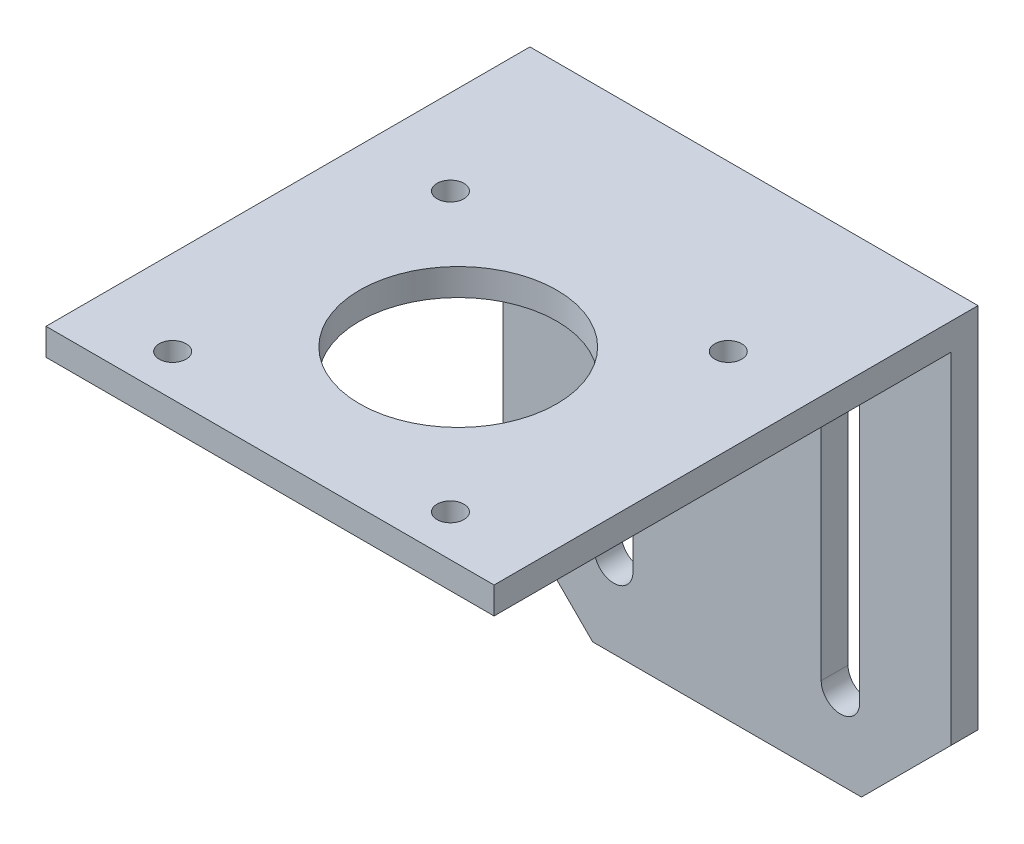
ISO-10303-21;
HEADER;
FILE_DESCRIPTION(('STEP AP214'),'2;1');
FILE_NAME('part.step','',(''),(''),'','','');
FILE_SCHEMA(('AUTOMOTIVE_DESIGN { 1 0 10303 214 1 1 1 1 }'));
ENDSEC;
DATA;
#1=APPLICATION_CONTEXT('core data for automotive mechanical design processes');
#2=APPLICATION_PROTOCOL_DEFINITION('international standard','automotive_design',2000,#1);
#3=PRODUCT_CONTEXT('',#1,'mechanical');
#4=PRODUCT('Part','Part','',(#3));
#5=PRODUCT_RELATED_PRODUCT_CATEGORY('part','',(#4));
#6=PRODUCT_DEFINITION_FORMATION('','',#4);
#7=PRODUCT_DEFINITION_CONTEXT('part definition',#1,'design');
#8=PRODUCT_DEFINITION('design','',#6,#7);
#9=PRODUCT_DEFINITION_SHAPE('','',#8);
#10=(LENGTH_UNIT() NAMED_UNIT(*) SI_UNIT(.MILLI.,.METRE.));
#11=(NAMED_UNIT(*) PLANE_ANGLE_UNIT() SI_UNIT($,.RADIAN.));
#12=(NAMED_UNIT(*) SI_UNIT($,.STERADIAN.) SOLID_ANGLE_UNIT());
#13=UNCERTAINTY_MEASURE_WITH_UNIT(LENGTH_MEASURE(1.E-05),#10,'distance_accuracy_value','');
#14=(GEOMETRIC_REPRESENTATION_CONTEXT(3) GLOBAL_UNCERTAINTY_ASSIGNED_CONTEXT((#13)) GLOBAL_UNIT_ASSIGNED_CONTEXT((#10,
#11,#12)) REPRESENTATION_CONTEXT('',''));
#15=CARTESIAN_POINT('',(0.,0.,0.));
#16=DIRECTION('',(0.,0.,1.));
#17=DIRECTION('',(1.,0.,0.));
#18=AXIS2_PLACEMENT_3D('',#15,#16,#17);
#19=CARTESIAN_POINT('',(0.,0.,3.));
#20=DIRECTION('',(0.,0.,1.));
#21=DIRECTION('',(1.,0.,0.));
#22=AXIS2_PLACEMENT_3D('',#19,#20,#21);
#23=PLANE('',#22);
#24=DIRECTION('',(1.,0.,0.));
#25=VECTOR('',#24,1.);
#26=CARTESIAN_POINT('',(25.,22.5,3.));
#27=LINE('',#26,#25);
#28=CARTESIAN_POINT('',(-25.,22.5,3.));
#29=VERTEX_POINT('',#28);
#30=CARTESIAN_POINT('',(25.,22.5,3.));
#31=VERTEX_POINT('',#30);
#32=EDGE_CURVE('E53',#29,#31,#27,.T.);
#33=ORIENTED_EDGE('',*,*,#32,.F.);
#34=DIRECTION('',(0.,-1.,0.));
#35=VECTOR('',#34,1.);
#36=CARTESIAN_POINT('',(-25.,-25.5,3.));
#37=LINE('',#36,#35);
#38=CARTESIAN_POINT('',(-25.,-15.5,3.));
#39=VERTEX_POINT('',#38);
#40=EDGE_CURVE('E173',#29,#39,#37,.T.);
#41=ORIENTED_EDGE('',*,*,#40,.T.);
#42=DIRECTION('',(-0.707106781186548,0.707106781186548,0.));
#43=VECTOR('',#42,1.);
#44=CARTESIAN_POINT('',(-15.,-25.5,3.));
#45=LINE('',#44,#43);
#46=CARTESIAN_POINT('',(-15.,-25.5,3.));
#47=VERTEX_POINT('',#46);
#48=EDGE_CURVE('E175',#47,#39,#45,.T.);
#49=ORIENTED_EDGE('',*,*,#48,.F.);
#50=DIRECTION('',(1.,0.,0.));
#51=VECTOR('',#50,1.);
#52=CARTESIAN_POINT('',(25.,-25.5,3.));
#53=LINE('',#52,#51);
#54=CARTESIAN_POINT('',(15.,-25.5,3.));
#55=VERTEX_POINT('',#54);
#56=EDGE_CURVE('E260',#47,#55,#53,.T.);
#57=ORIENTED_EDGE('',*,*,#56,.T.);
#58=DIRECTION('',(-0.707106781186547,-0.707106781186548,0.));
#59=VECTOR('',#58,1.);
#60=CARTESIAN_POINT('',(25.,-15.5,3.));
#61=LINE('',#60,#59);
#62=CARTESIAN_POINT('',(25.,-15.5,3.));
#63=VERTEX_POINT('',#62);
#64=EDGE_CURVE('E180',#63,#55,#61,.T.);
#65=ORIENTED_EDGE('',*,*,#64,.F.);
#66=DIRECTION('',(0.,1.,0.));
#67=VECTOR('',#66,1.);
#68=CARTESIAN_POINT('',(25.,-25.5,3.));
#69=LINE('',#68,#67);
#70=EDGE_CURVE('E264',#63,#31,#69,.T.);
#71=ORIENTED_EDGE('',*,*,#70,.T.);
#72=EDGE_LOOP('',(#33,#41,#49,#57,#65,#71));
#73=FACE_BOUND('',#72,.T.);
#74=DIRECTION('',(0.,-1.,0.));
#75=VECTOR('',#74,1.);
#76=CARTESIAN_POINT('',(-14.8,17.5,3.));
#77=LINE('',#76,#75);
#78=CARTESIAN_POINT('',(-14.8,17.5,3.));
#79=VERTEX_POINT('',#78);
#80=CARTESIAN_POINT('',(-14.8,-16.5,3.));
#81=VERTEX_POINT('',#80);
#82=EDGE_CURVE('E230',#79,#81,#77,.T.);
#83=ORIENTED_EDGE('',*,*,#82,.F.);
#84=CARTESIAN_POINT('',(-12.65,17.5,3.));
#85=DIRECTION('',(0.,0.,1.));
#86=DIRECTION('',(1.,0.,0.));
#87=AXIS2_PLACEMENT_3D('',#84,#85,#86);
#88=CIRCLE('',#87,2.15);
#89=CARTESIAN_POINT('',(-10.5,17.5,3.));
#90=VERTEX_POINT('',#89);
#91=EDGE_CURVE('E228',#90,#79,#88,.T.);
#92=ORIENTED_EDGE('',*,*,#91,.F.);
#93=DIRECTION('',(0.,1.,0.));
#94=VECTOR('',#93,1.);
#95=CARTESIAN_POINT('',(-10.5,17.5,3.));
#96=LINE('',#95,#94);
#97=CARTESIAN_POINT('',(-10.5,-16.5,3.));
#98=VERTEX_POINT('',#97);
#99=EDGE_CURVE('E236',#98,#90,#96,.T.);
#100=ORIENTED_EDGE('',*,*,#99,.F.);
#101=CARTESIAN_POINT('',(-12.65,-16.5,3.));
#102=DIRECTION('',(0.,0.,1.));
#103=DIRECTION('',(1.,0.,0.));
#104=AXIS2_PLACEMENT_3D('',#101,#102,#103);
#105=CIRCLE('',#104,2.15);
#106=EDGE_CURVE('E233',#81,#98,#105,.T.);
#107=ORIENTED_EDGE('',*,*,#106,.F.);
#108=EDGE_LOOP('',(#83,#92,#100,#107));
#109=FACE_BOUND('',#108,.T.);
#110=DIRECTION('',(0.,-1.,0.));
#111=VECTOR('',#110,1.);
#112=CARTESIAN_POINT('',(10.5,17.5,3.));
#113=LINE('',#112,#111);
#114=CARTESIAN_POINT('',(10.5,17.5,3.));
#115=VERTEX_POINT('',#114);
#116=CARTESIAN_POINT('',(10.5,-16.5,3.));
#117=VERTEX_POINT('',#116);
#118=EDGE_CURVE('E199',#115,#117,#113,.T.);
#119=ORIENTED_EDGE('',*,*,#118,.F.);
#120=CARTESIAN_POINT('',(12.65,17.5,3.));
#121=DIRECTION('',(0.,0.,1.));
#122=DIRECTION('',(-1.,0.,0.));
#123=AXIS2_PLACEMENT_3D('',#120,#121,#122);
#124=CIRCLE('',#123,2.15);
#125=CARTESIAN_POINT('',(14.8,17.5,3.));
#126=VERTEX_POINT('',#125);
#127=EDGE_CURVE('E197',#126,#115,#124,.T.);
#128=ORIENTED_EDGE('',*,*,#127,.F.);
#129=DIRECTION('',(0.,1.,0.));
#130=VECTOR('',#129,1.);
#131=CARTESIAN_POINT('',(14.8,17.5,3.));
#132=LINE('',#131,#130);
#133=CARTESIAN_POINT('',(14.8,-16.5,3.));
#134=VERTEX_POINT('',#133);
#135=EDGE_CURVE('E205',#134,#126,#132,.T.);
#136=ORIENTED_EDGE('',*,*,#135,.F.);
#137=CARTESIAN_POINT('',(12.65,-16.5,3.));
#138=DIRECTION('',(0.,0.,1.));
#139=DIRECTION('',(-1.,0.,0.));
#140=AXIS2_PLACEMENT_3D('',#137,#138,#139);
#141=CIRCLE('',#140,2.15);
#142=EDGE_CURVE('E202',#117,#134,#141,.T.);
#143=ORIENTED_EDGE('',*,*,#142,.F.);
#144=EDGE_LOOP('',(#119,#128,#136,#143));
#145=FACE_BOUND('',#144,.T.);
#146=ADVANCED_FACE('F36',(#73,#109,#145),#23,.T.);
#147=CARTESIAN_POINT('',(0.,0.,0.));
#148=DIRECTION('',(0.,0.,1.));
#149=DIRECTION('',(1.,0.,0.));
#150=AXIS2_PLACEMENT_3D('',#147,#148,#149);
#151=PLANE('',#150);
#152=CARTESIAN_POINT('',(-12.65,17.5,0.));
#153=DIRECTION('',(0.,0.,1.));
#154=DIRECTION('',(1.,0.,0.));
#155=AXIS2_PLACEMENT_3D('',#152,#153,#154);
#156=CIRCLE('',#155,2.15);
#157=CARTESIAN_POINT('',(-10.5,17.5,0.));
#158=VERTEX_POINT('',#157);
#159=CARTESIAN_POINT('',(-14.8,17.5,0.));
#160=VERTEX_POINT('',#159);
#161=EDGE_CURVE('E227',#158,#160,#156,.T.);
#162=ORIENTED_EDGE('',*,*,#161,.T.);
#163=DIRECTION('',(0.,-1.,0.));
#164=VECTOR('',#163,1.);
#165=CARTESIAN_POINT('',(-14.8,17.5,0.));
#166=LINE('',#165,#164);
#167=CARTESIAN_POINT('',(-14.8,-16.5,0.));
#168=VERTEX_POINT('',#167);
#169=EDGE_CURVE('E241',#160,#168,#166,.T.);
#170=ORIENTED_EDGE('',*,*,#169,.T.);
#171=CARTESIAN_POINT('',(-12.65,-16.5,0.));
#172=DIRECTION('',(0.,0.,1.));
#173=DIRECTION('',(1.,0.,0.));
#174=AXIS2_PLACEMENT_3D('',#171,#172,#173);
#175=CIRCLE('',#174,2.15);
#176=CARTESIAN_POINT('',(-10.5,-16.5,0.));
#177=VERTEX_POINT('',#176);
#178=EDGE_CURVE('E244',#168,#177,#175,.T.);
#179=ORIENTED_EDGE('',*,*,#178,.T.);
#180=DIRECTION('',(0.,1.,0.));
#181=VECTOR('',#180,1.);
#182=CARTESIAN_POINT('',(-10.5,17.5,0.));
#183=LINE('',#182,#181);
#184=EDGE_CURVE('E231',#177,#158,#183,.T.);
#185=ORIENTED_EDGE('',*,*,#184,.T.);
#186=EDGE_LOOP('',(#162,#170,#179,#185));
#187=FACE_BOUND('',#186,.T.);
#188=CARTESIAN_POINT('',(12.65,17.5,0.));
#189=DIRECTION('',(0.,0.,1.));
#190=DIRECTION('',(-1.,0.,0.));
#191=AXIS2_PLACEMENT_3D('',#188,#189,#190);
#192=CIRCLE('',#191,2.15);
#193=CARTESIAN_POINT('',(14.8,17.5,0.));
#194=VERTEX_POINT('',#193);
#195=CARTESIAN_POINT('',(10.5,17.5,0.));
#196=VERTEX_POINT('',#195);
#197=EDGE_CURVE('E190',#194,#196,#192,.T.);
#198=ORIENTED_EDGE('',*,*,#197,.T.);
#199=DIRECTION('',(0.,-1.,0.));
#200=VECTOR('',#199,1.);
#201=CARTESIAN_POINT('',(10.5,17.5,0.));
#202=LINE('',#201,#200);
#203=CARTESIAN_POINT('',(10.5,-16.5,0.));
#204=VERTEX_POINT('',#203);
#205=EDGE_CURVE('E210',#196,#204,#202,.T.);
#206=ORIENTED_EDGE('',*,*,#205,.T.);
#207=CARTESIAN_POINT('',(12.65,-16.5,0.));
#208=DIRECTION('',(0.,0.,1.));
#209=DIRECTION('',(-1.,0.,0.));
#210=AXIS2_PLACEMENT_3D('',#207,#208,#209);
#211=CIRCLE('',#210,2.15);
#212=CARTESIAN_POINT('',(14.8,-16.5,0.));
#213=VERTEX_POINT('',#212);
#214=EDGE_CURVE('E213',#204,#213,#211,.T.);
#215=ORIENTED_EDGE('',*,*,#214,.T.);
#216=DIRECTION('',(0.,1.,0.));
#217=VECTOR('',#216,1.);
#218=CARTESIAN_POINT('',(14.8,17.5,0.));
#219=LINE('',#218,#217);
#220=EDGE_CURVE('E200',#213,#194,#219,.T.);
#221=ORIENTED_EDGE('',*,*,#220,.T.);
#222=EDGE_LOOP('',(#198,#206,#215,#221));
#223=FACE_BOUND('',#222,.T.);
#224=DIRECTION('',(-0.707106781186547,-0.707106781186548,0.));
#225=VECTOR('',#224,1.);
#226=CARTESIAN_POINT('',(25.,-15.5,0.));
#227=LINE('',#226,#225);
#228=CARTESIAN_POINT('',(25.,-15.5,0.));
#229=VERTEX_POINT('',#228);
#230=CARTESIAN_POINT('',(15.,-25.5,0.));
#231=VERTEX_POINT('',#230);
#232=EDGE_CURVE('E183',#229,#231,#227,.T.);
#233=ORIENTED_EDGE('',*,*,#232,.T.);
#234=DIRECTION('',(1.,0.,0.));
#235=VECTOR('',#234,1.);
#236=CARTESIAN_POINT('',(25.,-25.5,0.));
#237=LINE('',#236,#235);
#238=CARTESIAN_POINT('',(-15.,-25.5,0.));
#239=VERTEX_POINT('',#238);
#240=EDGE_CURVE('E268',#239,#231,#237,.T.);
#241=ORIENTED_EDGE('',*,*,#240,.F.);
#242=DIRECTION('',(-0.707106781186548,0.707106781186548,0.));
#243=VECTOR('',#242,1.);
#244=CARTESIAN_POINT('',(-15.,-25.5,0.));
#245=LINE('',#244,#243);
#246=CARTESIAN_POINT('',(-25.,-15.5,0.));
#247=VERTEX_POINT('',#246);
#248=EDGE_CURVE('E61',#239,#247,#245,.T.);
#249=ORIENTED_EDGE('',*,*,#248,.T.);
#250=DIRECTION('',(0.,-1.,0.));
#251=VECTOR('',#250,1.);
#252=CARTESIAN_POINT('',(-25.,-25.5,0.));
#253=LINE('',#252,#251);
#254=CARTESIAN_POINT('',(-25.,25.5,0.));
#255=VERTEX_POINT('',#254);
#256=EDGE_CURVE('E258',#255,#247,#253,.T.);
#257=ORIENTED_EDGE('',*,*,#256,.F.);
#258=DIRECTION('',(-1.,0.,0.));
#259=VECTOR('',#258,1.);
#260=CARTESIAN_POINT('',(25.,25.5,0.));
#261=LINE('',#260,#259);
#262=CARTESIAN_POINT('',(25.,25.5,0.));
#263=VERTEX_POINT('',#262);
#264=EDGE_CURVE('E261',#263,#255,#261,.T.);
#265=ORIENTED_EDGE('',*,*,#264,.F.);
#266=DIRECTION('',(0.,1.,0.));
#267=VECTOR('',#266,1.);
#268=CARTESIAN_POINT('',(25.,-25.5,0.));
#269=LINE('',#268,#267);
#270=EDGE_CURVE('E271',#229,#263,#269,.T.);
#271=ORIENTED_EDGE('',*,*,#270,.F.);
#272=EDGE_LOOP('',(#233,#241,#249,#257,#265,#271));
#273=FACE_BOUND('',#272,.T.);
#274=ADVANCED_FACE('F307',(#187,#223,#273),#151,.F.);
#275=CARTESIAN_POINT('',(-25.,-25.5,3.));
#276=DIRECTION('',(1.,0.,0.));
#277=DIRECTION('',(0.,0.,-1.));
#278=AXIS2_PLACEMENT_3D('',#275,#276,#277);
#279=PLANE('',#278);
#280=DIRECTION('',(0.,0.,-1.));
#281=VECTOR('',#280,1.);
#282=CARTESIAN_POINT('',(-25.,-15.5,3.));
#283=LINE('',#282,#281);
#284=EDGE_CURVE('E193',#39,#247,#283,.T.);
#285=ORIENTED_EDGE('',*,*,#284,.F.);
#286=ORIENTED_EDGE('',*,*,#40,.F.);
#287=DIRECTION('',(0.,0.,-1.));
#288=VECTOR('',#287,1.);
#289=CARTESIAN_POINT('',(-25.,22.5,54.));
#290=LINE('',#289,#288);
#291=CARTESIAN_POINT('',(-25.,22.5,54.));
#292=VERTEX_POINT('',#291);
#293=EDGE_CURVE('E155',#292,#29,#290,.T.);
#294=ORIENTED_EDGE('',*,*,#293,.F.);
#295=DIRECTION('',(0.,-1.,0.));
#296=VECTOR('',#295,1.);
#297=CARTESIAN_POINT('',(-25.,22.5,54.));
#298=LINE('',#297,#296);
#299=CARTESIAN_POINT('',(-25.,25.5,54.));
#300=VERTEX_POINT('',#299);
#301=EDGE_CURVE('E162',#300,#292,#298,.T.);
#302=ORIENTED_EDGE('',*,*,#301,.F.);
#303=DIRECTION('',(0.,0.,-1.));
#304=VECTOR('',#303,1.);
#305=CARTESIAN_POINT('',(-25.,25.5,3.));
#306=LINE('',#305,#304);
#307=EDGE_CURVE('E45',#300,#255,#306,.T.);
#308=ORIENTED_EDGE('',*,*,#307,.T.);
#309=ORIENTED_EDGE('',*,*,#256,.T.);
#310=EDGE_LOOP('',(#285,#286,#294,#302,#308,#309));
#311=FACE_BOUND('',#310,.T.);
#312=ADVANCED_FACE('F38',(#311),#279,.F.);
#313=CARTESIAN_POINT('',(25.,-25.5,3.));
#314=DIRECTION('',(0.,1.,0.));
#315=DIRECTION('',(-1.,0.,0.));
#316=AXIS2_PLACEMENT_3D('',#313,#314,#315);
#317=PLANE('',#316);
#318=DIRECTION('',(0.,0.,-1.));
#319=VECTOR('',#318,1.);
#320=CARTESIAN_POINT('',(15.,-25.5,3.));
#321=LINE('',#320,#319);
#322=EDGE_CURVE('E182',#55,#231,#321,.T.);
#323=ORIENTED_EDGE('',*,*,#322,.F.);
#324=ORIENTED_EDGE('',*,*,#56,.F.);
#325=DIRECTION('',(0.,0.,-1.));
#326=VECTOR('',#325,1.);
#327=CARTESIAN_POINT('',(-15.,-25.5,3.));
#328=LINE('',#327,#326);
#329=EDGE_CURVE('E186',#47,#239,#328,.T.);
#330=ORIENTED_EDGE('',*,*,#329,.T.);
#331=ORIENTED_EDGE('',*,*,#240,.T.);
#332=EDGE_LOOP('',(#323,#324,#330,#331));
#333=FACE_BOUND('',#332,.T.);
#334=ADVANCED_FACE('F312',(#333),#317,.F.);
#335=CARTESIAN_POINT('',(25.,-25.5,3.));
#336=DIRECTION('',(-1.,0.,0.));
#337=DIRECTION('',(0.,0.,1.));
#338=AXIS2_PLACEMENT_3D('',#335,#336,#337);
#339=PLANE('',#338);
#340=DIRECTION('',(0.,0.,-1.));
#341=VECTOR('',#340,1.);
#342=CARTESIAN_POINT('',(25.,-15.5,3.));
#343=LINE('',#342,#341);
#344=EDGE_CURVE('E187',#63,#229,#343,.T.);
#345=ORIENTED_EDGE('',*,*,#344,.T.);
#346=ORIENTED_EDGE('',*,*,#270,.T.);
#347=DIRECTION('',(0.,0.,-1.));
#348=VECTOR('',#347,1.);
#349=CARTESIAN_POINT('',(25.,25.5,3.));
#350=LINE('',#349,#348);
#351=CARTESIAN_POINT('',(25.,25.5,54.));
#352=VERTEX_POINT('',#351);
#353=EDGE_CURVE('E11',#352,#263,#350,.T.);
#354=ORIENTED_EDGE('',*,*,#353,.F.);
#355=DIRECTION('',(0.,1.,0.));
#356=VECTOR('',#355,1.);
#357=CARTESIAN_POINT('',(25.,22.5,54.));
#358=LINE('',#357,#356);
#359=CARTESIAN_POINT('',(25.,22.5,54.));
#360=VERTEX_POINT('',#359);
#361=EDGE_CURVE('E161',#360,#352,#358,.T.);
#362=ORIENTED_EDGE('',*,*,#361,.F.);
#363=DIRECTION('',(0.,0.,-1.));
#364=VECTOR('',#363,1.);
#365=CARTESIAN_POINT('',(25.,22.5,54.));
#366=LINE('',#365,#364);
#367=EDGE_CURVE('E157',#360,#31,#366,.T.);
#368=ORIENTED_EDGE('',*,*,#367,.T.);
#369=ORIENTED_EDGE('',*,*,#70,.F.);
#370=EDGE_LOOP('',(#345,#346,#354,#362,#368,#369));
#371=FACE_BOUND('',#370,.T.);
#372=ADVANCED_FACE('F301',(#371),#339,.F.);
#373=CARTESIAN_POINT('',(25.,25.5,3.));
#374=DIRECTION('',(0.,-1.,0.));
#375=DIRECTION('',(1.,0.,0.));
#376=AXIS2_PLACEMENT_3D('',#373,#374,#375);
#377=PLANE('',#376);
#378=CARTESIAN_POINT('',(15.5,25.5,49.3672217103906));
#379=DIRECTION('',(0.,-1.,0.));
#380=DIRECTION('',(-1.,0.,0.));
#381=AXIS2_PLACEMENT_3D('',#378,#379,#380);
#382=CIRCLE('',#381,1.5);
#383=CARTESIAN_POINT('',(17.,25.5,49.3672217103906));
#384=VERTEX_POINT('',#383);
#385=EDGE_CURVE('E562',#384,#384,#382,.T.);
#386=ORIENTED_EDGE('',*,*,#385,.T.);
#387=EDGE_LOOP('',(#386));
#388=FACE_BOUND('',#387,.T.);
#389=CARTESIAN_POINT('',(15.5,25.5,18.3672217103906));
#390=DIRECTION('',(0.,-1.,0.));
#391=DIRECTION('',(-1.,0.,0.));
#392=AXIS2_PLACEMENT_3D('',#389,#390,#391);
#393=CIRCLE('',#392,1.5);
#394=CARTESIAN_POINT('',(17.,25.5,18.3672217103906));
#395=VERTEX_POINT('',#394);
#396=EDGE_CURVE('E563',#395,#395,#393,.T.);
#397=ORIENTED_EDGE('',*,*,#396,.T.);
#398=EDGE_LOOP('',(#397));
#399=FACE_BOUND('',#398,.T.);
#400=CARTESIAN_POINT('',(-15.5,25.5,18.3672217103906));
#401=DIRECTION('',(0.,-1.,0.));
#402=DIRECTION('',(1.,0.,0.));
#403=AXIS2_PLACEMENT_3D('',#400,#401,#402);
#404=CIRCLE('',#403,1.5);
#405=CARTESIAN_POINT('',(-14.,25.5,18.3672217103906));
#406=VERTEX_POINT('',#405);
#407=EDGE_CURVE('E566',#406,#406,#404,.T.);
#408=ORIENTED_EDGE('',*,*,#407,.T.);
#409=EDGE_LOOP('',(#408));
#410=FACE_BOUND('',#409,.T.);
#411=CARTESIAN_POINT('',(-15.5,25.5,49.3672217103906));
#412=DIRECTION('',(0.,-1.,0.));
#413=DIRECTION('',(1.,0.,0.));
#414=AXIS2_PLACEMENT_3D('',#411,#412,#413);
#415=CIRCLE('',#414,1.5);
#416=CARTESIAN_POINT('',(-14.,25.5,49.3672217103906));
#417=VERTEX_POINT('',#416);
#418=EDGE_CURVE('E279',#417,#417,#415,.T.);
#419=ORIENTED_EDGE('',*,*,#418,.T.);
#420=EDGE_LOOP('',(#419));
#421=FACE_BOUND('',#420,.T.);
#422=CARTESIAN_POINT('',(0.,25.5,33.));
#423=DIRECTION('',(0.,-1.,0.));
#424=DIRECTION('',(1.,0.,0.));
#425=AXIS2_PLACEMENT_3D('',#422,#423,#424);
#426=CIRCLE('',#425,11.);
#427=CARTESIAN_POINT('',(11.,25.5,33.));
#428=VERTEX_POINT('',#427);
#429=EDGE_CURVE('E290',#428,#428,#426,.T.);
#430=ORIENTED_EDGE('',*,*,#429,.T.);
#431=EDGE_LOOP('',(#430));
#432=FACE_BOUND('',#431,.T.);
#433=ORIENTED_EDGE('',*,*,#264,.T.);
#434=ORIENTED_EDGE('',*,*,#307,.F.);
#435=DIRECTION('',(-1.,0.,0.));
#436=VECTOR('',#435,1.);
#437=CARTESIAN_POINT('',(25.,25.5,54.));
#438=LINE('',#437,#436);
#439=EDGE_CURVE('E168',#352,#300,#438,.T.);
#440=ORIENTED_EDGE('',*,*,#439,.F.);
#441=ORIENTED_EDGE('',*,*,#353,.T.);
#442=EDGE_LOOP('',(#433,#434,#440,#441));
#443=FACE_BOUND('',#442,.T.);
#444=ADVANCED_FACE('F303',(#388,#399,#410,#421,#432,#443),#377,.F.);
#445=CARTESIAN_POINT('',(-12.65,17.5,3.));
#446=DIRECTION('',(0.,0.,-1.));
#447=DIRECTION('',(-1.,0.,0.));
#448=AXIS2_PLACEMENT_3D('',#445,#446,#447);
#449=CYLINDRICAL_SURFACE('',#448,2.15);
#450=ORIENTED_EDGE('',*,*,#161,.F.);
#451=DIRECTION('',(0.,0.,-1.));
#452=VECTOR('',#451,1.);
#453=CARTESIAN_POINT('',(-10.5,17.5,3.));
#454=LINE('',#453,#452);
#455=EDGE_CURVE('E238',#90,#158,#454,.T.);
#456=ORIENTED_EDGE('',*,*,#455,.F.);
#457=ORIENTED_EDGE('',*,*,#91,.T.);
#458=DIRECTION('',(0.,0.,-1.));
#459=VECTOR('',#458,1.);
#460=CARTESIAN_POINT('',(-14.8,17.5,3.));
#461=LINE('',#460,#459);
#462=EDGE_CURVE('E255',#79,#160,#461,.T.);
#463=ORIENTED_EDGE('',*,*,#462,.T.);
#464=EDGE_LOOP('',(#450,#456,#457,#463));
#465=FACE_BOUND('',#464,.T.);
#466=ADVANCED_FACE('F340',(#465),#449,.F.);
#467=CARTESIAN_POINT('',(-14.8,17.5,3.));
#468=DIRECTION('',(1.,0.,0.));
#469=DIRECTION('',(0.,1.,0.));
#470=AXIS2_PLACEMENT_3D('',#467,#468,#469);
#471=PLANE('',#470);
#472=ORIENTED_EDGE('',*,*,#169,.F.);
#473=ORIENTED_EDGE('',*,*,#462,.F.);
#474=ORIENTED_EDGE('',*,*,#82,.T.);
#475=DIRECTION('',(0.,0.,-1.));
#476=VECTOR('',#475,1.);
#477=CARTESIAN_POINT('',(-14.8,-16.5,3.));
#478=LINE('',#477,#476);
#479=EDGE_CURVE('E253',#81,#168,#478,.T.);
#480=ORIENTED_EDGE('',*,*,#479,.T.);
#481=EDGE_LOOP('',(#472,#473,#474,#480));
#482=FACE_BOUND('',#481,.T.);
#483=ADVANCED_FACE('F476',(#482),#471,.T.);
#484=CARTESIAN_POINT('',(-12.65,-16.5,3.));
#485=DIRECTION('',(0.,0.,-1.));
#486=DIRECTION('',(-1.,0.,0.));
#487=AXIS2_PLACEMENT_3D('',#484,#485,#486);
#488=CYLINDRICAL_SURFACE('',#487,2.15);
#489=ORIENTED_EDGE('',*,*,#178,.F.);
#490=ORIENTED_EDGE('',*,*,#479,.F.);
#491=ORIENTED_EDGE('',*,*,#106,.T.);
#492=DIRECTION('',(0.,0.,-1.));
#493=VECTOR('',#492,1.);
#494=CARTESIAN_POINT('',(-10.5,-16.5,3.));
#495=LINE('',#494,#493);
#496=EDGE_CURVE('E251',#98,#177,#495,.T.);
#497=ORIENTED_EDGE('',*,*,#496,.T.);
#498=EDGE_LOOP('',(#489,#490,#491,#497));
#499=FACE_BOUND('',#498,.T.);
#500=ADVANCED_FACE('F482',(#499),#488,.F.);
#501=CARTESIAN_POINT('',(-10.5,17.5,3.));
#502=DIRECTION('',(-1.,0.,0.));
#503=DIRECTION('',(0.,-1.,0.));
#504=AXIS2_PLACEMENT_3D('',#501,#502,#503);
#505=PLANE('',#504);
#506=ORIENTED_EDGE('',*,*,#184,.F.);
#507=ORIENTED_EDGE('',*,*,#496,.F.);
#508=ORIENTED_EDGE('',*,*,#99,.T.);
#509=ORIENTED_EDGE('',*,*,#455,.T.);
#510=EDGE_LOOP('',(#506,#507,#508,#509));
#511=FACE_BOUND('',#510,.T.);
#512=ADVANCED_FACE('F489',(#511),#505,.T.);
#513=CARTESIAN_POINT('',(12.65,17.5,3.));
#514=DIRECTION('',(0.,0.,-1.));
#515=DIRECTION('',(-1.,0.,0.));
#516=AXIS2_PLACEMENT_3D('',#513,#514,#515);
#517=CYLINDRICAL_SURFACE('',#516,2.15);
#518=ORIENTED_EDGE('',*,*,#197,.F.);
#519=DIRECTION('',(0.,0.,-1.));
#520=VECTOR('',#519,1.);
#521=CARTESIAN_POINT('',(14.8,17.5,3.));
#522=LINE('',#521,#520);
#523=EDGE_CURVE('E207',#126,#194,#522,.T.);
#524=ORIENTED_EDGE('',*,*,#523,.F.);
#525=ORIENTED_EDGE('',*,*,#127,.T.);
#526=DIRECTION('',(0.,0.,-1.));
#527=VECTOR('',#526,1.);
#528=CARTESIAN_POINT('',(10.5,17.5,3.));
#529=LINE('',#528,#527);
#530=EDGE_CURVE('E224',#115,#196,#529,.T.);
#531=ORIENTED_EDGE('',*,*,#530,.T.);
#532=EDGE_LOOP('',(#518,#524,#525,#531));
#533=FACE_BOUND('',#532,.T.);
#534=ADVANCED_FACE('F497',(#533),#517,.F.);
#535=CARTESIAN_POINT('',(10.5,17.5,3.));
#536=DIRECTION('',(1.,0.,0.));
#537=DIRECTION('',(0.,1.,0.));
#538=AXIS2_PLACEMENT_3D('',#535,#536,#537);
#539=PLANE('',#538);
#540=ORIENTED_EDGE('',*,*,#205,.F.);
#541=ORIENTED_EDGE('',*,*,#530,.F.);
#542=ORIENTED_EDGE('',*,*,#118,.T.);
#543=DIRECTION('',(0.,0.,-1.));
#544=VECTOR('',#543,1.);
#545=CARTESIAN_POINT('',(10.5,-16.5,3.));
#546=LINE('',#545,#544);
#547=EDGE_CURVE('E222',#117,#204,#546,.T.);
#548=ORIENTED_EDGE('',*,*,#547,.T.);
#549=EDGE_LOOP('',(#540,#541,#542,#548));
#550=FACE_BOUND('',#549,.T.);
#551=ADVANCED_FACE('F505',(#550),#539,.T.);
#552=CARTESIAN_POINT('',(12.65,-16.5,3.));
#553=DIRECTION('',(0.,0.,-1.));
#554=DIRECTION('',(-1.,0.,0.));
#555=AXIS2_PLACEMENT_3D('',#552,#553,#554);
#556=CYLINDRICAL_SURFACE('',#555,2.15);
#557=ORIENTED_EDGE('',*,*,#214,.F.);
#558=ORIENTED_EDGE('',*,*,#547,.F.);
#559=ORIENTED_EDGE('',*,*,#142,.T.);
#560=DIRECTION('',(0.,0.,-1.));
#561=VECTOR('',#560,1.);
#562=CARTESIAN_POINT('',(14.8,-16.5,3.));
#563=LINE('',#562,#561);
#564=EDGE_CURVE('E220',#134,#213,#563,.T.);
#565=ORIENTED_EDGE('',*,*,#564,.T.);
#566=EDGE_LOOP('',(#557,#558,#559,#565));
#567=FACE_BOUND('',#566,.T.);
#568=ADVANCED_FACE('F328',(#567),#556,.F.);
#569=CARTESIAN_POINT('',(14.8,17.5,3.));
#570=DIRECTION('',(-1.,0.,0.));
#571=DIRECTION('',(0.,-1.,0.));
#572=AXIS2_PLACEMENT_3D('',#569,#570,#571);
#573=PLANE('',#572);
#574=ORIENTED_EDGE('',*,*,#220,.F.);
#575=ORIENTED_EDGE('',*,*,#564,.F.);
#576=ORIENTED_EDGE('',*,*,#135,.T.);
#577=ORIENTED_EDGE('',*,*,#523,.T.);
#578=EDGE_LOOP('',(#574,#575,#576,#577));
#579=FACE_BOUND('',#578,.T.);
#580=ADVANCED_FACE('F321',(#579),#573,.T.);
#581=CARTESIAN_POINT('',(25.,-15.5,3.));
#582=DIRECTION('',(0.707106781186548,-0.707106781186547,0.));
#583=DIRECTION('',(0.707106781186547,0.707106781186548,0.));
#584=AXIS2_PLACEMENT_3D('',#581,#582,#583);
#585=PLANE('',#584);
#586=ORIENTED_EDGE('',*,*,#232,.F.);
#587=ORIENTED_EDGE('',*,*,#344,.F.);
#588=ORIENTED_EDGE('',*,*,#64,.T.);
#589=ORIENTED_EDGE('',*,*,#322,.T.);
#590=EDGE_LOOP('',(#586,#587,#588,#589));
#591=FACE_BOUND('',#590,.T.);
#592=ADVANCED_FACE('F319',(#591),#585,.T.);
#593=CARTESIAN_POINT('',(-15.,-25.5,3.));
#594=DIRECTION('',(-0.707106781186547,-0.707106781186547,0.));
#595=DIRECTION('',(0.707106781186548,-0.707106781186548,0.));
#596=AXIS2_PLACEMENT_3D('',#593,#594,#595);
#597=PLANE('',#596);
#598=ORIENTED_EDGE('',*,*,#248,.F.);
#599=ORIENTED_EDGE('',*,*,#329,.F.);
#600=ORIENTED_EDGE('',*,*,#48,.T.);
#601=ORIENTED_EDGE('',*,*,#284,.T.);
#602=EDGE_LOOP('',(#598,#599,#600,#601));
#603=FACE_BOUND('',#602,.T.);
#604=ADVANCED_FACE('F315',(#603),#597,.T.);
#605=CARTESIAN_POINT('',(25.,22.5,54.));
#606=DIRECTION('',(0.,1.,0.));
#607=DIRECTION('',(-1.,0.,0.));
#608=AXIS2_PLACEMENT_3D('',#605,#606,#607);
#609=PLANE('',#608);
#610=CARTESIAN_POINT('',(15.5,22.5,49.3672217103906));
#611=DIRECTION('',(0.,1.,0.));
#612=DIRECTION('',(-1.,0.,0.));
#613=AXIS2_PLACEMENT_3D('',#610,#611,#612);
#614=CIRCLE('',#613,1.5);
#615=CARTESIAN_POINT('',(17.,22.5,49.3672217103906));
#616=VERTEX_POINT('',#615);
#617=EDGE_CURVE('E40',#616,#616,#614,.T.);
#618=ORIENTED_EDGE('',*,*,#617,.T.);
#619=EDGE_LOOP('',(#618));
#620=FACE_BOUND('',#619,.T.);
#621=CARTESIAN_POINT('',(15.5,22.5,18.3672217103906));
#622=DIRECTION('',(0.,1.,0.));
#623=DIRECTION('',(-1.,0.,0.));
#624=AXIS2_PLACEMENT_3D('',#621,#622,#623);
#625=CIRCLE('',#624,1.5);
#626=CARTESIAN_POINT('',(17.,22.5,18.3672217103906));
#627=VERTEX_POINT('',#626);
#628=EDGE_CURVE('E281',#627,#627,#625,.T.);
#629=ORIENTED_EDGE('',*,*,#628,.T.);
#630=EDGE_LOOP('',(#629));
#631=FACE_BOUND('',#630,.T.);
#632=CARTESIAN_POINT('',(-15.5,22.5,18.3672217103906));
#633=DIRECTION('',(0.,1.,0.));
#634=DIRECTION('',(-1.,0.,0.));
#635=AXIS2_PLACEMENT_3D('',#632,#633,#634);
#636=CIRCLE('',#635,1.5);
#637=CARTESIAN_POINT('',(-14.,22.5,18.3672217103906));
#638=VERTEX_POINT('',#637);
#639=EDGE_CURVE('E278',#638,#638,#636,.T.);
#640=ORIENTED_EDGE('',*,*,#639,.T.);
#641=EDGE_LOOP('',(#640));
#642=FACE_BOUND('',#641,.T.);
#643=CARTESIAN_POINT('',(-15.5,22.5,49.3672217103906));
#644=DIRECTION('',(0.,1.,0.));
#645=DIRECTION('',(-1.,0.,0.));
#646=AXIS2_PLACEMENT_3D('',#643,#644,#645);
#647=CIRCLE('',#646,1.5);
#648=CARTESIAN_POINT('',(-14.,22.5,49.3672217103906));
#649=VERTEX_POINT('',#648);
#650=EDGE_CURVE('E275',#649,#649,#647,.T.);
#651=ORIENTED_EDGE('',*,*,#650,.T.);
#652=EDGE_LOOP('',(#651));
#653=FACE_BOUND('',#652,.T.);
#654=CARTESIAN_POINT('',(0.,22.5,33.));
#655=DIRECTION('',(0.,-1.,0.));
#656=DIRECTION('',(1.,0.,0.));
#657=AXIS2_PLACEMENT_3D('',#654,#655,#656);
#658=CIRCLE('',#657,11.);
#659=CARTESIAN_POINT('',(11.,22.5,33.));
#660=VERTEX_POINT('',#659);
#661=EDGE_CURVE('E286',#660,#660,#658,.T.);
#662=ORIENTED_EDGE('',*,*,#661,.F.);
#663=EDGE_LOOP('',(#662));
#664=FACE_BOUND('',#663,.T.);
#665=ORIENTED_EDGE('',*,*,#32,.T.);
#666=ORIENTED_EDGE('',*,*,#367,.F.);
#667=DIRECTION('',(1.,0.,0.));
#668=VECTOR('',#667,1.);
#669=CARTESIAN_POINT('',(25.,22.5,54.));
#670=LINE('',#669,#668);
#671=EDGE_CURVE('E151',#292,#360,#670,.T.);
#672=ORIENTED_EDGE('',*,*,#671,.F.);
#673=ORIENTED_EDGE('',*,*,#293,.T.);
#674=EDGE_LOOP('',(#665,#666,#672,#673));
#675=FACE_BOUND('',#674,.T.);
#676=ADVANCED_FACE('F153',(#620,#631,#642,#653,#664,#675),#609,.F.);
#677=CARTESIAN_POINT('',(0.,0.,54.));
#678=DIRECTION('',(0.,0.,1.));
#679=DIRECTION('',(1.,0.,0.));
#680=AXIS2_PLACEMENT_3D('',#677,#678,#679);
#681=PLANE('',#680);
#682=ORIENTED_EDGE('',*,*,#301,.T.);
#683=ORIENTED_EDGE('',*,*,#671,.T.);
#684=ORIENTED_EDGE('',*,*,#361,.T.);
#685=ORIENTED_EDGE('',*,*,#439,.T.);
#686=EDGE_LOOP('',(#682,#683,#684,#685));
#687=FACE_BOUND('',#686,.T.);
#688=ADVANCED_FACE('F166',(#687),#681,.T.);
#689=CARTESIAN_POINT('',(0.,25.5,33.));
#690=DIRECTION('',(0.,-1.,0.));
#691=DIRECTION('',(1.,0.,0.));
#692=AXIS2_PLACEMENT_3D('',#689,#690,#691);
#693=CYLINDRICAL_SURFACE('',#692,11.);
#694=ORIENTED_EDGE('',*,*,#429,.F.);
#695=EDGE_LOOP('',(#694));
#696=FACE_BOUND('',#695,.T.);
#697=ORIENTED_EDGE('',*,*,#661,.T.);
#698=EDGE_LOOP('',(#697));
#699=FACE_BOUND('',#698,.T.);
#700=ADVANCED_FACE('F397',(#696,#699),#693,.F.);
#701=CARTESIAN_POINT('',(-15.5,25.5,49.3672217103906));
#702=DIRECTION('',(0.,-1.,0.));
#703=DIRECTION('',(1.,0.,0.));
#704=AXIS2_PLACEMENT_3D('',#701,#702,#703);
#705=CYLINDRICAL_SURFACE('',#704,1.5);
#706=CARTESIAN_POINT('',(-14.,25.5,49.3672217103906));
#707=CARTESIAN_POINT('',(-14.,25.46875,49.3672217103906));
#708=CARTESIAN_POINT('',(-14.,25.4375,49.3672217103906));
#709=CARTESIAN_POINT('',(-14.,25.375,49.3672217103906));
#710=CARTESIAN_POINT('',(-14.,25.34375,49.3672217103906));
#711=CARTESIAN_POINT('',(-14.,25.28125,49.3672217103906));
#712=CARTESIAN_POINT('',(-14.,25.25,49.3672217103906));
#713=CARTESIAN_POINT('',(-14.,25.1875,49.3672217103906));
#714=CARTESIAN_POINT('',(-14.,25.15625,49.3672217103906));
#715=CARTESIAN_POINT('',(-14.,25.09375,49.3672217103906));
#716=CARTESIAN_POINT('',(-14.,25.0625,49.3672217103906));
#717=CARTESIAN_POINT('',(-14.,25.,49.3672217103906));
#718=CARTESIAN_POINT('',(-14.,24.96875,49.3672217103906));
#719=CARTESIAN_POINT('',(-14.,24.90625,49.3672217103906));
#720=CARTESIAN_POINT('',(-14.,24.875,49.3672217103906));
#721=CARTESIAN_POINT('',(-14.,24.8125,49.3672217103906));
#722=CARTESIAN_POINT('',(-14.,24.78125,49.3672217103906));
#723=CARTESIAN_POINT('',(-14.,24.71875,49.3672217103906));
#724=CARTESIAN_POINT('',(-14.,24.6875,49.3672217103906));
#725=CARTESIAN_POINT('',(-14.,24.625,49.3672217103906));
#726=CARTESIAN_POINT('',(-14.,24.59375,49.3672217103906));
#727=CARTESIAN_POINT('',(-14.,24.53125,49.3672217103906));
#728=CARTESIAN_POINT('',(-14.,24.5,49.3672217103906));
#729=CARTESIAN_POINT('',(-14.,24.4375,49.3672217103906));
#730=CARTESIAN_POINT('',(-14.,24.40625,49.3672217103906));
#731=CARTESIAN_POINT('',(-14.,24.34375,49.3672217103906));
#732=CARTESIAN_POINT('',(-14.,24.3125,49.3672217103906));
#733=CARTESIAN_POINT('',(-14.,24.25,49.3672217103906));
#734=CARTESIAN_POINT('',(-14.,24.21875,49.3672217103906));
#735=CARTESIAN_POINT('',(-14.,24.15625,49.3672217103906));
#736=CARTESIAN_POINT('',(-14.,24.125,49.3672217103906));
#737=CARTESIAN_POINT('',(-14.,24.0625,49.3672217103906));
#738=CARTESIAN_POINT('',(-14.,24.03125,49.3672217103906));
#739=CARTESIAN_POINT('',(-14.,23.96875,49.3672217103906));
#740=CARTESIAN_POINT('',(-14.,23.9375,49.3672217103906));
#741=CARTESIAN_POINT('',(-14.,23.875,49.3672217103906));
#742=CARTESIAN_POINT('',(-14.,23.84375,49.3672217103906));
#743=CARTESIAN_POINT('',(-14.,23.78125,49.3672217103906));
#744=CARTESIAN_POINT('',(-14.,23.75,49.3672217103906));
#745=CARTESIAN_POINT('',(-14.,23.6875,49.3672217103906));
#746=CARTESIAN_POINT('',(-14.,23.65625,49.3672217103906));
#747=CARTESIAN_POINT('',(-14.,23.59375,49.3672217103906));
#748=CARTESIAN_POINT('',(-14.,23.5625,49.3672217103906));
#749=CARTESIAN_POINT('',(-14.,23.5,49.3672217103906));
#750=CARTESIAN_POINT('',(-14.,23.46875,49.3672217103906));
#751=CARTESIAN_POINT('',(-14.,23.40625,49.3672217103906));
#752=CARTESIAN_POINT('',(-14.,23.375,49.3672217103906));
#753=CARTESIAN_POINT('',(-14.,23.3125,49.3672217103906));
#754=CARTESIAN_POINT('',(-14.,23.28125,49.3672217103906));
#755=CARTESIAN_POINT('',(-14.,23.21875,49.3672217103906));
#756=CARTESIAN_POINT('',(-14.,23.1875,49.3672217103906));
#757=CARTESIAN_POINT('',(-14.,23.125,49.3672217103906));
#758=CARTESIAN_POINT('',(-14.,23.09375,49.3672217103906));
#759=CARTESIAN_POINT('',(-14.,23.03125,49.3672217103906));
#760=CARTESIAN_POINT('',(-14.,23.,49.3672217103906));
#761=CARTESIAN_POINT('',(-14.,22.9375,49.3672217103906));
#762=CARTESIAN_POINT('',(-14.,22.90625,49.3672217103906));
#763=CARTESIAN_POINT('',(-14.,22.84375,49.3672217103906));
#764=CARTESIAN_POINT('',(-14.,22.8125,49.3672217103906));
#765=CARTESIAN_POINT('',(-14.,22.75,49.3672217103906));
#766=CARTESIAN_POINT('',(-14.,22.71875,49.3672217103906));
#767=CARTESIAN_POINT('',(-14.,22.65625,49.3672217103906));
#768=CARTESIAN_POINT('',(-14.,22.625,49.3672217103906));
#769=CARTESIAN_POINT('',(-14.,22.5625,49.3672217103906));
#770=CARTESIAN_POINT('',(-14.,22.53125,49.3672217103906));
#771=CARTESIAN_POINT('',(-14.,22.5,49.3672217103906));
#772=B_SPLINE_CURVE_WITH_KNOTS('',3,(#706,#707,#708,#709,#710,#711,#712,#713,#714,#715,#716,
#717,#718,#719,#720,#721,#722,#723,#724,#725,#726,#727,#728,#729,#730,#731,#732,#733,#734,#735,
#736,#737,#738,#739,#740,#741,#742,#743,#744,#745,#746,#747,#748,#749,#750,#751,#752,#753,#754,
#755,#756,#757,#758,#759,#760,#761,#762,#763,#764,#765,#766,#767,#768,#769,#770,#771),
.UNSPECIFIED.,.F.,.F.,(4,2,2,2,2,2,2,2,2,2,2,2,2,2,2,2,2,2,2,2,2,2,2,2,2,2,2,2,2,2,2,2,4),(0.,
0.0937500000000036,0.187500000000004,0.281250000000004,0.375000000000004,0.468750000000004,
0.562500000000004,0.656250000000004,0.750000000000004,0.843750000000004,0.937500000000004,
1.03125000000001,1.12500000000001,1.21875000000001,1.31250000000001,1.40625000000001,
1.50000000000001,1.59375000000001,1.68750000000001,1.78125000000001,1.87500000000001,
1.96875000000001,2.06250000000001,2.15625000000001,2.25000000000001,2.34375000000001,
2.43750000000001,2.53125000000001,2.62500000000001,2.71875000000001,2.81250000000001,
2.90625000000002,3.00000000000002),.UNSPECIFIED.);
#773=EDGE_CURVE('BSEAM404',#417,#649,#772,.T.);
#774=ORIENTED_EDGE('',*,*,#418,.F.);
#775=ORIENTED_EDGE('',*,*,#650,.F.);
#776=ORIENTED_EDGE('',*,*,#773,.T.);
#777=ORIENTED_EDGE('',*,*,#773,.F.);
#778=EDGE_LOOP('',(#774,#776,#775,#777));
#779=FACE_BOUND('',#778,.T.);
#780=ADVANCED_FACE('F404',(#779),#705,.F.);
#781=CARTESIAN_POINT('',(-15.5,25.5,18.3672217103906));
#782=DIRECTION('',(0.,-1.,0.));
#783=DIRECTION('',(1.,0.,0.));
#784=AXIS2_PLACEMENT_3D('',#781,#782,#783);
#785=CYLINDRICAL_SURFACE('',#784,1.5);
#786=CARTESIAN_POINT('',(-14.,25.5,18.3672217103906));
#787=CARTESIAN_POINT('',(-14.,25.46875,18.3672217103906));
#788=CARTESIAN_POINT('',(-14.,25.4375,18.3672217103906));
#789=CARTESIAN_POINT('',(-14.,25.375,18.3672217103906));
#790=CARTESIAN_POINT('',(-14.,25.34375,18.3672217103906));
#791=CARTESIAN_POINT('',(-14.,25.28125,18.3672217103906));
#792=CARTESIAN_POINT('',(-14.,25.25,18.3672217103906));
#793=CARTESIAN_POINT('',(-14.,25.1875,18.3672217103906));
#794=CARTESIAN_POINT('',(-14.,25.15625,18.3672217103906));
#795=CARTESIAN_POINT('',(-14.,25.09375,18.3672217103906));
#796=CARTESIAN_POINT('',(-14.,25.0625,18.3672217103906));
#797=CARTESIAN_POINT('',(-14.,25.,18.3672217103906));
#798=CARTESIAN_POINT('',(-14.,24.96875,18.3672217103906));
#799=CARTESIAN_POINT('',(-14.,24.90625,18.3672217103906));
#800=CARTESIAN_POINT('',(-14.,24.875,18.3672217103906));
#801=CARTESIAN_POINT('',(-14.,24.8125,18.3672217103906));
#802=CARTESIAN_POINT('',(-14.,24.78125,18.3672217103906));
#803=CARTESIAN_POINT('',(-14.,24.71875,18.3672217103906));
#804=CARTESIAN_POINT('',(-14.,24.6875,18.3672217103906));
#805=CARTESIAN_POINT('',(-14.,24.625,18.3672217103906));
#806=CARTESIAN_POINT('',(-14.,24.59375,18.3672217103906));
#807=CARTESIAN_POINT('',(-14.,24.53125,18.3672217103906));
#808=CARTESIAN_POINT('',(-14.,24.5,18.3672217103906));
#809=CARTESIAN_POINT('',(-14.,24.4375,18.3672217103906));
#810=CARTESIAN_POINT('',(-14.,24.40625,18.3672217103906));
#811=CARTESIAN_POINT('',(-14.,24.34375,18.3672217103906));
#812=CARTESIAN_POINT('',(-14.,24.3125,18.3672217103906));
#813=CARTESIAN_POINT('',(-14.,24.25,18.3672217103906));
#814=CARTESIAN_POINT('',(-14.,24.21875,18.3672217103906));
#815=CARTESIAN_POINT('',(-14.,24.15625,18.3672217103906));
#816=CARTESIAN_POINT('',(-14.,24.125,18.3672217103906));
#817=CARTESIAN_POINT('',(-14.,24.0625,18.3672217103906));
#818=CARTESIAN_POINT('',(-14.,24.03125,18.3672217103906));
#819=CARTESIAN_POINT('',(-14.,23.96875,18.3672217103906));
#820=CARTESIAN_POINT('',(-14.,23.9375,18.3672217103906));
#821=CARTESIAN_POINT('',(-14.,23.875,18.3672217103906));
#822=CARTESIAN_POINT('',(-14.,23.84375,18.3672217103906));
#823=CARTESIAN_POINT('',(-14.,23.78125,18.3672217103906));
#824=CARTESIAN_POINT('',(-14.,23.75,18.3672217103906));
#825=CARTESIAN_POINT('',(-14.,23.6875,18.3672217103906));
#826=CARTESIAN_POINT('',(-14.,23.65625,18.3672217103906));
#827=CARTESIAN_POINT('',(-14.,23.59375,18.3672217103906));
#828=CARTESIAN_POINT('',(-14.,23.5625,18.3672217103906));
#829=CARTESIAN_POINT('',(-14.,23.5,18.3672217103906));
#830=CARTESIAN_POINT('',(-14.,23.46875,18.3672217103906));
#831=CARTESIAN_POINT('',(-14.,23.40625,18.3672217103906));
#832=CARTESIAN_POINT('',(-14.,23.375,18.3672217103906));
#833=CARTESIAN_POINT('',(-14.,23.3125,18.3672217103906));
#834=CARTESIAN_POINT('',(-14.,23.28125,18.3672217103906));
#835=CARTESIAN_POINT('',(-14.,23.21875,18.3672217103906));
#836=CARTESIAN_POINT('',(-14.,23.1875,18.3672217103906));
#837=CARTESIAN_POINT('',(-14.,23.125,18.3672217103906));
#838=CARTESIAN_POINT('',(-14.,23.09375,18.3672217103906));
#839=CARTESIAN_POINT('',(-14.,23.03125,18.3672217103906));
#840=CARTESIAN_POINT('',(-14.,23.,18.3672217103906));
#841=CARTESIAN_POINT('',(-14.,22.9375,18.3672217103906));
#842=CARTESIAN_POINT('',(-14.,22.90625,18.3672217103906));
#843=CARTESIAN_POINT('',(-14.,22.84375,18.3672217103906));
#844=CARTESIAN_POINT('',(-14.,22.8125,18.3672217103906));
#845=CARTESIAN_POINT('',(-14.,22.75,18.3672217103906));
#846=CARTESIAN_POINT('',(-14.,22.71875,18.3672217103906));
#847=CARTESIAN_POINT('',(-14.,22.65625,18.3672217103906));
#848=CARTESIAN_POINT('',(-14.,22.625,18.3672217103906));
#849=CARTESIAN_POINT('',(-14.,22.5625,18.3672217103906));
#850=CARTESIAN_POINT('',(-14.,22.53125,18.3672217103906));
#851=CARTESIAN_POINT('',(-14.,22.5,18.3672217103906));
#852=B_SPLINE_CURVE_WITH_KNOTS('',3,(#786,#787,#788,#789,#790,#791,#792,#793,#794,#795,#796,
#797,#798,#799,#800,#801,#802,#803,#804,#805,#806,#807,#808,#809,#810,#811,#812,#813,#814,#815,
#816,#817,#818,#819,#820,#821,#822,#823,#824,#825,#826,#827,#828,#829,#830,#831,#832,#833,#834,
#835,#836,#837,#838,#839,#840,#841,#842,#843,#844,#845,#846,#847,#848,#849,#850,#851),
.UNSPECIFIED.,.F.,.F.,(4,2,2,2,2,2,2,2,2,2,2,2,2,2,2,2,2,2,2,2,2,2,2,2,2,2,2,2,2,2,2,2,4),(0.,
0.0937500000000036,0.187500000000004,0.281250000000004,0.375000000000004,0.468750000000004,
0.562500000000004,0.656250000000004,0.750000000000004,0.843750000000004,0.937500000000004,
1.03125000000001,1.12500000000001,1.21875000000001,1.31250000000001,1.40625000000001,
1.50000000000001,1.59375000000001,1.68750000000001,1.78125000000001,1.87500000000001,
1.96875000000001,2.06250000000001,2.15625000000001,2.25000000000001,2.34375000000001,
2.43750000000001,2.53125000000001,2.62500000000001,2.71875000000001,2.81250000000001,
2.90625000000002,3.00000000000002),.UNSPECIFIED.);
#853=EDGE_CURVE('BSEAM411',#406,#638,#852,.T.);
#854=ORIENTED_EDGE('',*,*,#407,.F.);
#855=ORIENTED_EDGE('',*,*,#639,.F.);
#856=ORIENTED_EDGE('',*,*,#853,.T.);
#857=ORIENTED_EDGE('',*,*,#853,.F.);
#858=EDGE_LOOP('',(#854,#856,#855,#857));
#859=FACE_BOUND('',#858,.T.);
#860=ADVANCED_FACE('F411',(#859),#785,.F.);
#861=CARTESIAN_POINT('',(15.5,25.5,18.3672217103906));
#862=DIRECTION('',(0.,-1.,0.));
#863=DIRECTION('',(1.,0.,0.));
#864=AXIS2_PLACEMENT_3D('',#861,#862,#863);
#865=CYLINDRICAL_SURFACE('',#864,1.5);
#866=CARTESIAN_POINT('',(17.,25.5,18.3672217103906));
#867=CARTESIAN_POINT('',(17.,25.46875,18.3672217103906));
#868=CARTESIAN_POINT('',(17.,25.4375,18.3672217103906));
#869=CARTESIAN_POINT('',(17.,25.375,18.3672217103906));
#870=CARTESIAN_POINT('',(17.,25.34375,18.3672217103906));
#871=CARTESIAN_POINT('',(17.,25.28125,18.3672217103906));
#872=CARTESIAN_POINT('',(17.,25.25,18.3672217103906));
#873=CARTESIAN_POINT('',(17.,25.1875,18.3672217103906));
#874=CARTESIAN_POINT('',(17.,25.15625,18.3672217103906));
#875=CARTESIAN_POINT('',(17.,25.09375,18.3672217103906));
#876=CARTESIAN_POINT('',(17.,25.0625,18.3672217103906));
#877=CARTESIAN_POINT('',(17.,25.,18.3672217103906));
#878=CARTESIAN_POINT('',(17.,24.96875,18.3672217103906));
#879=CARTESIAN_POINT('',(17.,24.90625,18.3672217103906));
#880=CARTESIAN_POINT('',(17.,24.875,18.3672217103906));
#881=CARTESIAN_POINT('',(17.,24.8125,18.3672217103906));
#882=CARTESIAN_POINT('',(17.,24.78125,18.3672217103906));
#883=CARTESIAN_POINT('',(17.,24.71875,18.3672217103906));
#884=CARTESIAN_POINT('',(17.,24.6875,18.3672217103906));
#885=CARTESIAN_POINT('',(17.,24.625,18.3672217103906));
#886=CARTESIAN_POINT('',(17.,24.59375,18.3672217103906));
#887=CARTESIAN_POINT('',(17.,24.53125,18.3672217103906));
#888=CARTESIAN_POINT('',(17.,24.5,18.3672217103906));
#889=CARTESIAN_POINT('',(17.,24.4375,18.3672217103906));
#890=CARTESIAN_POINT('',(17.,24.40625,18.3672217103906));
#891=CARTESIAN_POINT('',(17.,24.34375,18.3672217103906));
#892=CARTESIAN_POINT('',(17.,24.3125,18.3672217103906));
#893=CARTESIAN_POINT('',(17.,24.25,18.3672217103906));
#894=CARTESIAN_POINT('',(17.,24.21875,18.3672217103906));
#895=CARTESIAN_POINT('',(17.,24.15625,18.3672217103906));
#896=CARTESIAN_POINT('',(17.,24.125,18.3672217103906));
#897=CARTESIAN_POINT('',(17.,24.0625,18.3672217103906));
#898=CARTESIAN_POINT('',(17.,24.03125,18.3672217103906));
#899=CARTESIAN_POINT('',(17.,23.96875,18.3672217103906));
#900=CARTESIAN_POINT('',(17.,23.9375,18.3672217103906));
#901=CARTESIAN_POINT('',(17.,23.875,18.3672217103906));
#902=CARTESIAN_POINT('',(17.,23.84375,18.3672217103906));
#903=CARTESIAN_POINT('',(17.,23.78125,18.3672217103906));
#904=CARTESIAN_POINT('',(17.,23.75,18.3672217103906));
#905=CARTESIAN_POINT('',(17.,23.6875,18.3672217103906));
#906=CARTESIAN_POINT('',(17.,23.65625,18.3672217103906));
#907=CARTESIAN_POINT('',(17.,23.59375,18.3672217103906));
#908=CARTESIAN_POINT('',(17.,23.5625,18.3672217103906));
#909=CARTESIAN_POINT('',(17.,23.5,18.3672217103906));
#910=CARTESIAN_POINT('',(17.,23.46875,18.3672217103906));
#911=CARTESIAN_POINT('',(17.,23.40625,18.3672217103906));
#912=CARTESIAN_POINT('',(17.,23.375,18.3672217103906));
#913=CARTESIAN_POINT('',(17.,23.3125,18.3672217103906));
#914=CARTESIAN_POINT('',(17.,23.28125,18.3672217103906));
#915=CARTESIAN_POINT('',(17.,23.21875,18.3672217103906));
#916=CARTESIAN_POINT('',(17.,23.1875,18.3672217103906));
#917=CARTESIAN_POINT('',(17.,23.125,18.3672217103906));
#918=CARTESIAN_POINT('',(17.,23.09375,18.3672217103906));
#919=CARTESIAN_POINT('',(17.,23.03125,18.3672217103906));
#920=CARTESIAN_POINT('',(17.,23.,18.3672217103906));
#921=CARTESIAN_POINT('',(17.,22.9375,18.3672217103906));
#922=CARTESIAN_POINT('',(17.,22.90625,18.3672217103906));
#923=CARTESIAN_POINT('',(17.,22.84375,18.3672217103906));
#924=CARTESIAN_POINT('',(17.,22.8125,18.3672217103906));
#925=CARTESIAN_POINT('',(17.,22.75,18.3672217103906));
#926=CARTESIAN_POINT('',(17.,22.71875,18.3672217103906));
#927=CARTESIAN_POINT('',(17.,22.65625,18.3672217103906));
#928=CARTESIAN_POINT('',(17.,22.625,18.3672217103906));
#929=CARTESIAN_POINT('',(17.,22.5625,18.3672217103906));
#930=CARTESIAN_POINT('',(17.,22.53125,18.3672217103906));
#931=CARTESIAN_POINT('',(17.,22.5,18.3672217103906));
#932=B_SPLINE_CURVE_WITH_KNOTS('',3,(#866,#867,#868,#869,#870,#871,#872,#873,#874,#875,#876,
#877,#878,#879,#880,#881,#882,#883,#884,#885,#886,#887,#888,#889,#890,#891,#892,#893,#894,#895,
#896,#897,#898,#899,#900,#901,#902,#903,#904,#905,#906,#907,#908,#909,#910,#911,#912,#913,#914,
#915,#916,#917,#918,#919,#920,#921,#922,#923,#924,#925,#926,#927,#928,#929,#930,#931),
.UNSPECIFIED.,.F.,.F.,(4,2,2,2,2,2,2,2,2,2,2,2,2,2,2,2,2,2,2,2,2,2,2,2,2,2,2,2,2,2,2,2,4),(0.,
0.0937500000000036,0.187500000000004,0.281250000000004,0.375000000000004,0.468750000000004,
0.562500000000004,0.656250000000004,0.750000000000004,0.843750000000004,0.937500000000004,
1.03125000000001,1.12500000000001,1.21875000000001,1.31250000000001,1.40625000000001,
1.50000000000001,1.59375000000001,1.68750000000001,1.78125000000001,1.87500000000001,
1.96875000000001,2.06250000000001,2.15625000000001,2.25000000000001,2.34375000000001,
2.43750000000001,2.53125000000001,2.62500000000001,2.71875000000001,2.81250000000001,
2.90625000000002,3.00000000000002),.UNSPECIFIED.);
#933=EDGE_CURVE('BSEAM419',#395,#627,#932,.T.);
#934=ORIENTED_EDGE('',*,*,#396,.F.);
#935=ORIENTED_EDGE('',*,*,#628,.F.);
#936=ORIENTED_EDGE('',*,*,#933,.T.);
#937=ORIENTED_EDGE('',*,*,#933,.F.);
#938=EDGE_LOOP('',(#934,#936,#935,#937));
#939=FACE_BOUND('',#938,.T.);
#940=ADVANCED_FACE('F419',(#939),#865,.F.);
#941=CARTESIAN_POINT('',(15.5,25.5,49.3672217103906));
#942=DIRECTION('',(0.,-1.,0.));
#943=DIRECTION('',(1.,0.,0.));
#944=AXIS2_PLACEMENT_3D('',#941,#942,#943);
#945=CYLINDRICAL_SURFACE('',#944,1.5);
#946=CARTESIAN_POINT('',(17.,25.5,49.3672217103906));
#947=CARTESIAN_POINT('',(17.,25.46875,49.3672217103906));
#948=CARTESIAN_POINT('',(17.,25.4375,49.3672217103906));
#949=CARTESIAN_POINT('',(17.,25.375,49.3672217103906));
#950=CARTESIAN_POINT('',(17.,25.34375,49.3672217103906));
#951=CARTESIAN_POINT('',(17.,25.28125,49.3672217103906));
#952=CARTESIAN_POINT('',(17.,25.25,49.3672217103906));
#953=CARTESIAN_POINT('',(17.,25.1875,49.3672217103906));
#954=CARTESIAN_POINT('',(17.,25.15625,49.3672217103906));
#955=CARTESIAN_POINT('',(17.,25.09375,49.3672217103906));
#956=CARTESIAN_POINT('',(17.,25.0625,49.3672217103906));
#957=CARTESIAN_POINT('',(17.,25.,49.3672217103906));
#958=CARTESIAN_POINT('',(17.,24.96875,49.3672217103906));
#959=CARTESIAN_POINT('',(17.,24.90625,49.3672217103906));
#960=CARTESIAN_POINT('',(17.,24.875,49.3672217103906));
#961=CARTESIAN_POINT('',(17.,24.8125,49.3672217103906));
#962=CARTESIAN_POINT('',(17.,24.78125,49.3672217103906));
#963=CARTESIAN_POINT('',(17.,24.71875,49.3672217103906));
#964=CARTESIAN_POINT('',(17.,24.6875,49.3672217103906));
#965=CARTESIAN_POINT('',(17.,24.625,49.3672217103906));
#966=CARTESIAN_POINT('',(17.,24.59375,49.3672217103906));
#967=CARTESIAN_POINT('',(17.,24.53125,49.3672217103906));
#968=CARTESIAN_POINT('',(17.,24.5,49.3672217103906));
#969=CARTESIAN_POINT('',(17.,24.4375,49.3672217103906));
#970=CARTESIAN_POINT('',(17.,24.40625,49.3672217103906));
#971=CARTESIAN_POINT('',(17.,24.34375,49.3672217103906));
#972=CARTESIAN_POINT('',(17.,24.3125,49.3672217103906));
#973=CARTESIAN_POINT('',(17.,24.25,49.3672217103906));
#974=CARTESIAN_POINT('',(17.,24.21875,49.3672217103906));
#975=CARTESIAN_POINT('',(17.,24.15625,49.3672217103906));
#976=CARTESIAN_POINT('',(17.,24.125,49.3672217103906));
#977=CARTESIAN_POINT('',(17.,24.0625,49.3672217103906));
#978=CARTESIAN_POINT('',(17.,24.03125,49.3672217103906));
#979=CARTESIAN_POINT('',(17.,23.96875,49.3672217103906));
#980=CARTESIAN_POINT('',(17.,23.9375,49.3672217103906));
#981=CARTESIAN_POINT('',(17.,23.875,49.3672217103906));
#982=CARTESIAN_POINT('',(17.,23.84375,49.3672217103906));
#983=CARTESIAN_POINT('',(17.,23.78125,49.3672217103906));
#984=CARTESIAN_POINT('',(17.,23.75,49.3672217103906));
#985=CARTESIAN_POINT('',(17.,23.6875,49.3672217103906));
#986=CARTESIAN_POINT('',(17.,23.65625,49.3672217103906));
#987=CARTESIAN_POINT('',(17.,23.59375,49.3672217103906));
#988=CARTESIAN_POINT('',(17.,23.5625,49.3672217103906));
#989=CARTESIAN_POINT('',(17.,23.5,49.3672217103906));
#990=CARTESIAN_POINT('',(17.,23.46875,49.3672217103906));
#991=CARTESIAN_POINT('',(17.,23.40625,49.3672217103906));
#992=CARTESIAN_POINT('',(17.,23.375,49.3672217103906));
#993=CARTESIAN_POINT('',(17.,23.3125,49.3672217103906));
#994=CARTESIAN_POINT('',(17.,23.28125,49.3672217103906));
#995=CARTESIAN_POINT('',(17.,23.21875,49.3672217103906));
#996=CARTESIAN_POINT('',(17.,23.1875,49.3672217103906));
#997=CARTESIAN_POINT('',(17.,23.125,49.3672217103906));
#998=CARTESIAN_POINT('',(17.,23.09375,49.3672217103906));
#999=CARTESIAN_POINT('',(17.,23.03125,49.3672217103906));
#1000=CARTESIAN_POINT('',(17.,23.,49.3672217103906));
#1001=CARTESIAN_POINT('',(17.,22.9375,49.3672217103906));
#1002=CARTESIAN_POINT('',(17.,22.90625,49.3672217103906));
#1003=CARTESIAN_POINT('',(17.,22.84375,49.3672217103906));
#1004=CARTESIAN_POINT('',(17.,22.8125,49.3672217103906));
#1005=CARTESIAN_POINT('',(17.,22.75,49.3672217103906));
#1006=CARTESIAN_POINT('',(17.,22.71875,49.3672217103906));
#1007=CARTESIAN_POINT('',(17.,22.65625,49.3672217103906));
#1008=CARTESIAN_POINT('',(17.,22.625,49.3672217103906));
#1009=CARTESIAN_POINT('',(17.,22.5625,49.3672217103906));
#1010=CARTESIAN_POINT('',(17.,22.53125,49.3672217103906));
#1011=CARTESIAN_POINT('',(17.,22.5,49.3672217103906));
#1012=B_SPLINE_CURVE_WITH_KNOTS('',3,(#946,#947,#948,#949,#950,#951,#952,#953,#954,#955,#956,
#957,#958,#959,#960,#961,#962,#963,#964,#965,#966,#967,#968,#969,#970,#971,#972,#973,#974,#975,
#976,#977,#978,#979,#980,#981,#982,#983,#984,#985,#986,#987,#988,#989,#990,#991,#992,#993,#994,
#995,#996,#997,#998,#999,#1000,#1001,#1002,#1003,#1004,#1005,#1006,#1007,#1008,#1009,#1010,
#1011),.UNSPECIFIED.,.F.,.F.,(4,2,2,2,2,2,2,2,2,2,2,2,2,2,2,2,2,2,2,2,2,2,2,2,2,2,2,2,2,2,2,2,
4),(0.,0.0937500000000036,0.187500000000004,0.281250000000004,0.375000000000004,
0.468750000000004,0.562500000000004,0.656250000000004,0.750000000000004,0.843750000000004,
0.937500000000004,1.03125000000001,1.12500000000001,1.21875000000001,1.31250000000001,
1.40625000000001,1.50000000000001,1.59375000000001,1.68750000000001,1.78125000000001,
1.87500000000001,1.96875000000001,2.06250000000001,2.15625000000001,2.25000000000001,
2.34375000000001,2.43750000000001,2.53125000000001,2.62500000000001,2.71875000000001,
2.81250000000001,2.90625000000002,3.00000000000002),.UNSPECIFIED.);
#1013=EDGE_CURVE('BSEAM427',#384,#616,#1012,.T.);
#1014=ORIENTED_EDGE('',*,*,#385,.F.);
#1015=ORIENTED_EDGE('',*,*,#617,.F.);
#1016=ORIENTED_EDGE('',*,*,#1013,.T.);
#1017=ORIENTED_EDGE('',*,*,#1013,.F.);
#1018=EDGE_LOOP('',(#1014,#1016,#1015,#1017));
#1019=FACE_BOUND('',#1018,.T.);
#1020=ADVANCED_FACE('F427',(#1019),#945,.F.);
#1021=CLOSED_SHELL('',(#146,#274,#312,#334,#372,#444,#466,#483,#500,#512,#534,#551,#568,#580,
#592,#604,#676,#688,#700,#780,#860,#940,#1020));
#1022=MANIFOLD_SOLID_BREP('B2',#1021);
#1023=ADVANCED_BREP_SHAPE_REPRESENTATION('',(#18,#1022),#14);
#1024=SHAPE_DEFINITION_REPRESENTATION(#9,#1023);
ENDSEC;
END-ISO-10303-21;
